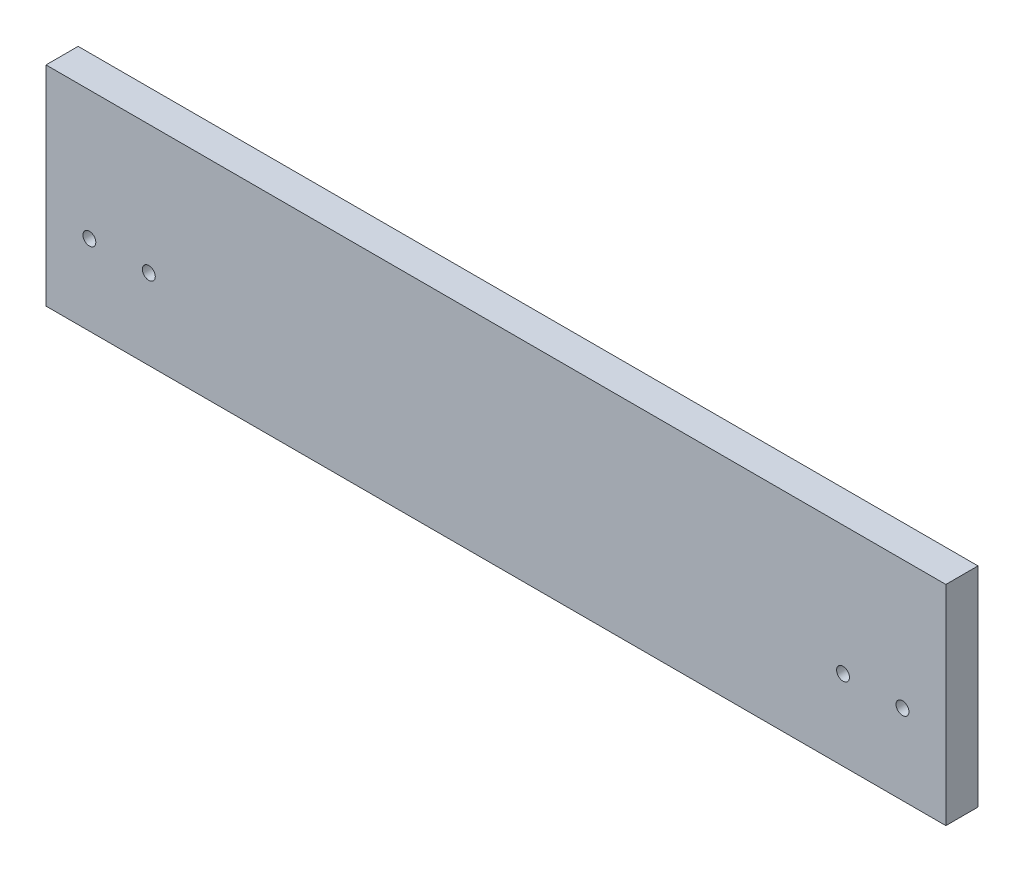
ISO-10303-21;
HEADER;
FILE_DESCRIPTION(('STEP AP214'),'2;1');
FILE_NAME('part.step','',(''),(''),'','','');
FILE_SCHEMA(('AUTOMOTIVE_DESIGN { 1 0 10303 214 1 1 1 1 }'));
ENDSEC;
DATA;
#1=APPLICATION_CONTEXT('core data for automotive mechanical design processes');
#2=APPLICATION_PROTOCOL_DEFINITION('international standard','automotive_design',2000,#1);
#3=PRODUCT_CONTEXT('',#1,'mechanical');
#4=PRODUCT('Part','Part','',(#3));
#5=PRODUCT_RELATED_PRODUCT_CATEGORY('part','',(#4));
#6=PRODUCT_DEFINITION_FORMATION('','',#4);
#7=PRODUCT_DEFINITION_CONTEXT('part definition',#1,'design');
#8=PRODUCT_DEFINITION('design','',#6,#7);
#9=PRODUCT_DEFINITION_SHAPE('','',#8);
#10=(LENGTH_UNIT() NAMED_UNIT(*) SI_UNIT(.MILLI.,.METRE.));
#11=(NAMED_UNIT(*) PLANE_ANGLE_UNIT() SI_UNIT($,.RADIAN.));
#12=(NAMED_UNIT(*) SI_UNIT($,.STERADIAN.) SOLID_ANGLE_UNIT());
#13=UNCERTAINTY_MEASURE_WITH_UNIT(LENGTH_MEASURE(1.E-05),#10,'distance_accuracy_value','');
#14=(GEOMETRIC_REPRESENTATION_CONTEXT(3) GLOBAL_UNCERTAINTY_ASSIGNED_CONTEXT((#13)) GLOBAL_UNIT_ASSIGNED_CONTEXT((#10,
#11,#12)) REPRESENTATION_CONTEXT('',''));
#15=CARTESIAN_POINT('',(0.,0.,0.));
#16=DIRECTION('',(0.,0.,1.));
#17=DIRECTION('',(1.,0.,0.));
#18=AXIS2_PLACEMENT_3D('',#15,#16,#17);
#19=CARTESIAN_POINT('',(0.,0.,10.));
#20=DIRECTION('',(-1.,0.,0.));
#21=DIRECTION('',(0.,-1.,0.));
#22=AXIS2_PLACEMENT_3D('',#19,#20,#21);
#23=PLANE('',#22);
#24=DIRECTION('',(0.,1.,0.));
#25=VECTOR('',#24,1.);
#26=CARTESIAN_POINT('',(0.,0.,0.));
#27=LINE('',#26,#25);
#28=CARTESIAN_POINT('',(0.,0.,0.));
#29=VERTEX_POINT('',#28);
#30=CARTESIAN_POINT('',(0.,65.,0.));
#31=VERTEX_POINT('',#30);
#32=EDGE_CURVE('E100',#29,#31,#27,.T.);
#33=ORIENTED_EDGE('',*,*,#32,.T.);
#34=DIRECTION('',(0.,0.,-1.));
#35=VECTOR('',#34,1.);
#36=CARTESIAN_POINT('',(0.,65.,10.));
#37=LINE('',#36,#35);
#38=CARTESIAN_POINT('',(0.,65.,10.));
#39=VERTEX_POINT('',#38);
#40=EDGE_CURVE('E11',#39,#31,#37,.T.);
#41=ORIENTED_EDGE('',*,*,#40,.F.);
#42=DIRECTION('',(0.,1.,0.));
#43=VECTOR('',#42,1.);
#44=CARTESIAN_POINT('',(0.,0.,10.));
#45=LINE('',#44,#43);
#46=CARTESIAN_POINT('',(0.,0.,10.));
#47=VERTEX_POINT('',#46);
#48=EDGE_CURVE('E88',#47,#39,#45,.T.);
#49=ORIENTED_EDGE('',*,*,#48,.F.);
#50=DIRECTION('',(0.,0.,-1.));
#51=VECTOR('',#50,1.);
#52=CARTESIAN_POINT('',(0.,0.,10.));
#53=LINE('',#52,#51);
#54=EDGE_CURVE('E96',#47,#29,#53,.T.);
#55=ORIENTED_EDGE('',*,*,#54,.T.);
#56=EDGE_LOOP('',(#33,#41,#49,#55));
#57=FACE_BOUND('',#56,.T.);
#58=ADVANCED_FACE('F37',(#57),#23,.F.);
#59=CARTESIAN_POINT('',(0.,65.,10.));
#60=DIRECTION('',(0.,-1.,0.));
#61=DIRECTION('',(1.,0.,0.));
#62=AXIS2_PLACEMENT_3D('',#59,#60,#61);
#63=PLANE('',#62);
#64=DIRECTION('',(-1.,0.,0.));
#65=VECTOR('',#64,1.);
#66=CARTESIAN_POINT('',(0.,65.,0.));
#67=LINE('',#66,#65);
#68=CARTESIAN_POINT('',(-280.,65.,0.));
#69=VERTEX_POINT('',#68);
#70=EDGE_CURVE('E92',#31,#69,#67,.T.);
#71=ORIENTED_EDGE('',*,*,#70,.T.);
#72=DIRECTION('',(0.,0.,-1.));
#73=VECTOR('',#72,1.);
#74=CARTESIAN_POINT('',(-280.,65.,10.));
#75=LINE('',#74,#73);
#76=CARTESIAN_POINT('',(-280.,65.,10.));
#77=VERTEX_POINT('',#76);
#78=EDGE_CURVE('E45',#77,#69,#75,.T.);
#79=ORIENTED_EDGE('',*,*,#78,.F.);
#80=DIRECTION('',(-1.,0.,0.));
#81=VECTOR('',#80,1.);
#82=CARTESIAN_POINT('',(0.,65.,10.));
#83=LINE('',#82,#81);
#84=EDGE_CURVE('E83',#39,#77,#83,.T.);
#85=ORIENTED_EDGE('',*,*,#84,.F.);
#86=ORIENTED_EDGE('',*,*,#40,.T.);
#87=EDGE_LOOP('',(#71,#79,#85,#86));
#88=FACE_BOUND('',#87,.T.);
#89=ADVANCED_FACE('F91',(#88),#63,.F.);
#90=CARTESIAN_POINT('',(-280.,0.,10.));
#91=DIRECTION('',(1.,0.,0.));
#92=DIRECTION('',(0.,0.,-1.));
#93=AXIS2_PLACEMENT_3D('',#90,#91,#92);
#94=PLANE('',#93);
#95=DIRECTION('',(0.,-1.,0.));
#96=VECTOR('',#95,1.);
#97=CARTESIAN_POINT('',(-280.,0.,0.));
#98=LINE('',#97,#96);
#99=CARTESIAN_POINT('',(-280.,0.,0.));
#100=VERTEX_POINT('',#99);
#101=EDGE_CURVE('E70',#69,#100,#98,.T.);
#102=ORIENTED_EDGE('',*,*,#101,.T.);
#103=DIRECTION('',(0.,0.,-1.));
#104=VECTOR('',#103,1.);
#105=CARTESIAN_POINT('',(-280.,0.,10.));
#106=LINE('',#105,#104);
#107=CARTESIAN_POINT('',(-280.,0.,10.));
#108=VERTEX_POINT('',#107);
#109=EDGE_CURVE('E93',#108,#100,#106,.T.);
#110=ORIENTED_EDGE('',*,*,#109,.F.);
#111=DIRECTION('',(0.,-1.,0.));
#112=VECTOR('',#111,1.);
#113=CARTESIAN_POINT('',(-280.,0.,10.));
#114=LINE('',#113,#112);
#115=EDGE_CURVE('E86',#77,#108,#114,.T.);
#116=ORIENTED_EDGE('',*,*,#115,.F.);
#117=ORIENTED_EDGE('',*,*,#78,.T.);
#118=EDGE_LOOP('',(#102,#110,#116,#117));
#119=FACE_BOUND('',#118,.T.);
#120=ADVANCED_FACE('F94',(#119),#94,.F.);
#121=CARTESIAN_POINT('',(0.,0.,10.));
#122=DIRECTION('',(0.,1.,0.));
#123=DIRECTION('',(-1.,0.,0.));
#124=AXIS2_PLACEMENT_3D('',#121,#122,#123);
#125=PLANE('',#124);
#126=DIRECTION('',(1.,0.,0.));
#127=VECTOR('',#126,1.);
#128=CARTESIAN_POINT('',(0.,0.,0.));
#129=LINE('',#128,#127);
#130=EDGE_CURVE('E76',#100,#29,#129,.T.);
#131=ORIENTED_EDGE('',*,*,#130,.T.);
#132=ORIENTED_EDGE('',*,*,#54,.F.);
#133=DIRECTION('',(1.,0.,0.));
#134=VECTOR('',#133,1.);
#135=CARTESIAN_POINT('',(0.,0.,10.));
#136=LINE('',#135,#134);
#137=EDGE_CURVE('E53',#108,#47,#136,.T.);
#138=ORIENTED_EDGE('',*,*,#137,.F.);
#139=ORIENTED_EDGE('',*,*,#109,.T.);
#140=EDGE_LOOP('',(#131,#132,#138,#139));
#141=FACE_BOUND('',#140,.T.);
#142=ADVANCED_FACE('F108',(#141),#125,.F.);
#143=CARTESIAN_POINT('',(0.,0.,10.));
#144=DIRECTION('',(0.,0.,1.));
#145=DIRECTION('',(1.,0.,0.));
#146=AXIS2_PLACEMENT_3D('',#143,#144,#145);
#147=PLANE('',#146);
#148=CARTESIAN_POINT('',(-266.5,24.9336942218761,10.));
#149=DIRECTION('',(0.,0.,-1.));
#150=DIRECTION('',(-1.,0.,0.));
#151=AXIS2_PLACEMENT_3D('',#148,#149,#150);
#152=CIRCLE('',#151,2.);
#153=CARTESIAN_POINT('',(-268.5,24.9336942218761,10.));
#154=VERTEX_POINT('',#153);
#155=EDGE_CURVE('E127',#154,#154,#152,.T.);
#156=ORIENTED_EDGE('',*,*,#155,.T.);
#157=EDGE_LOOP('',(#156));
#158=FACE_BOUND('',#157,.T.);
#159=CARTESIAN_POINT('',(-13.5,24.9336942218761,10.));
#160=DIRECTION('',(0.,0.,-1.));
#161=DIRECTION('',(-1.,0.,0.));
#162=AXIS2_PLACEMENT_3D('',#159,#160,#161);
#163=CIRCLE('',#162,2.);
#164=CARTESIAN_POINT('',(-15.5,24.9336942218761,10.));
#165=VERTEX_POINT('',#164);
#166=EDGE_CURVE('E120',#165,#165,#163,.T.);
#167=ORIENTED_EDGE('',*,*,#166,.T.);
#168=EDGE_LOOP('',(#167));
#169=FACE_BOUND('',#168,.T.);
#170=CARTESIAN_POINT('',(-32.,24.9336942218761,10.));
#171=DIRECTION('',(0.,0.,-1.));
#172=DIRECTION('',(-1.,0.,0.));
#173=AXIS2_PLACEMENT_3D('',#170,#171,#172);
#174=CIRCLE('',#173,2.);
#175=CARTESIAN_POINT('',(-34.,24.9336942218761,10.));
#176=VERTEX_POINT('',#175);
#177=EDGE_CURVE('E132',#176,#176,#174,.T.);
#178=ORIENTED_EDGE('',*,*,#177,.T.);
#179=EDGE_LOOP('',(#178));
#180=FACE_BOUND('',#179,.T.);
#181=CARTESIAN_POINT('',(-248.,24.9336942218761,10.));
#182=DIRECTION('',(0.,0.,-1.));
#183=DIRECTION('',(-1.,0.,0.));
#184=AXIS2_PLACEMENT_3D('',#181,#182,#183);
#185=CIRCLE('',#184,1.99999999999997);
#186=CARTESIAN_POINT('',(-250.,24.9336942218761,10.));
#187=VERTEX_POINT('',#186);
#188=EDGE_CURVE('E103',#187,#187,#185,.T.);
#189=ORIENTED_EDGE('',*,*,#188,.T.);
#190=EDGE_LOOP('',(#189));
#191=FACE_BOUND('',#190,.T.);
#192=ORIENTED_EDGE('',*,*,#48,.T.);
#193=ORIENTED_EDGE('',*,*,#84,.T.);
#194=ORIENTED_EDGE('',*,*,#115,.T.);
#195=ORIENTED_EDGE('',*,*,#137,.T.);
#196=EDGE_LOOP('',(#192,#193,#194,#195));
#197=FACE_BOUND('',#196,.T.);
#198=ADVANCED_FACE('F84',(#158,#169,#180,#191,#197),#147,.T.);
#199=CARTESIAN_POINT('',(0.,0.,0.));
#200=DIRECTION('',(0.,0.,1.));
#201=DIRECTION('',(1.,0.,0.));
#202=AXIS2_PLACEMENT_3D('',#199,#200,#201);
#203=PLANE('',#202);
#204=CARTESIAN_POINT('',(-266.5,24.9336942218761,0.));
#205=DIRECTION('',(0.,0.,-1.));
#206=DIRECTION('',(-1.,0.,0.));
#207=AXIS2_PLACEMENT_3D('',#204,#205,#206);
#208=CIRCLE('',#207,2.);
#209=CARTESIAN_POINT('',(-268.5,24.9336942218761,0.));
#210=VERTEX_POINT('',#209);
#211=EDGE_CURVE('E117',#210,#210,#208,.T.);
#212=ORIENTED_EDGE('',*,*,#211,.F.);
#213=EDGE_LOOP('',(#212));
#214=FACE_BOUND('',#213,.T.);
#215=CARTESIAN_POINT('',(-13.5,24.9336942218761,0.));
#216=DIRECTION('',(0.,0.,-1.));
#217=DIRECTION('',(-1.,0.,0.));
#218=AXIS2_PLACEMENT_3D('',#215,#216,#217);
#219=CIRCLE('',#218,2.);
#220=CARTESIAN_POINT('',(-15.5,24.9336942218761,0.));
#221=VERTEX_POINT('',#220);
#222=EDGE_CURVE('E123',#221,#221,#219,.T.);
#223=ORIENTED_EDGE('',*,*,#222,.F.);
#224=EDGE_LOOP('',(#223));
#225=FACE_BOUND('',#224,.T.);
#226=CARTESIAN_POINT('',(-32.,24.9336942218761,0.));
#227=DIRECTION('',(0.,0.,-1.));
#228=DIRECTION('',(-1.,0.,0.));
#229=AXIS2_PLACEMENT_3D('',#226,#227,#228);
#230=CIRCLE('',#229,2.);
#231=CARTESIAN_POINT('',(-34.,24.9336942218761,0.));
#232=VERTEX_POINT('',#231);
#233=EDGE_CURVE('E124',#232,#232,#230,.T.);
#234=ORIENTED_EDGE('',*,*,#233,.F.);
#235=EDGE_LOOP('',(#234));
#236=FACE_BOUND('',#235,.T.);
#237=CARTESIAN_POINT('',(-248.,24.9336942218761,0.));
#238=DIRECTION('',(0.,0.,-1.));
#239=DIRECTION('',(-1.,0.,0.));
#240=AXIS2_PLACEMENT_3D('',#237,#238,#239);
#241=CIRCLE('',#240,1.99999999999997);
#242=CARTESIAN_POINT('',(-250.,24.9336942218761,0.));
#243=VERTEX_POINT('',#242);
#244=EDGE_CURVE('E114',#243,#243,#241,.T.);
#245=ORIENTED_EDGE('',*,*,#244,.F.);
#246=EDGE_LOOP('',(#245));
#247=FACE_BOUND('',#246,.T.);
#248=ORIENTED_EDGE('',*,*,#32,.F.);
#249=ORIENTED_EDGE('',*,*,#130,.F.);
#250=ORIENTED_EDGE('',*,*,#101,.F.);
#251=ORIENTED_EDGE('',*,*,#70,.F.);
#252=EDGE_LOOP('',(#248,#249,#250,#251));
#253=FACE_BOUND('',#252,.T.);
#254=ADVANCED_FACE('F111',(#214,#225,#236,#247,#253),#203,.F.);
#255=CARTESIAN_POINT('',(-248.,24.9336942218761,10.));
#256=DIRECTION('',(0.,0.,-1.));
#257=DIRECTION('',(-1.,0.,0.));
#258=AXIS2_PLACEMENT_3D('',#255,#256,#257);
#259=CYLINDRICAL_SURFACE('',#258,1.99999999999997);
#260=ORIENTED_EDGE('',*,*,#188,.F.);
#261=EDGE_LOOP('',(#260));
#262=FACE_BOUND('',#261,.T.);
#263=ORIENTED_EDGE('',*,*,#244,.T.);
#264=EDGE_LOOP('',(#263));
#265=FACE_BOUND('',#264,.T.);
#266=ADVANCED_FACE('F142',(#262,#265),#259,.F.);
#267=CARTESIAN_POINT('',(-32.,24.9336942218761,10.));
#268=DIRECTION('',(0.,0.,-1.));
#269=DIRECTION('',(-1.,0.,0.));
#270=AXIS2_PLACEMENT_3D('',#267,#268,#269);
#271=CYLINDRICAL_SURFACE('',#270,2.);
#272=ORIENTED_EDGE('',*,*,#177,.F.);
#273=EDGE_LOOP('',(#272));
#274=FACE_BOUND('',#273,.T.);
#275=ORIENTED_EDGE('',*,*,#233,.T.);
#276=EDGE_LOOP('',(#275));
#277=FACE_BOUND('',#276,.T.);
#278=ADVANCED_FACE('F138',(#274,#277),#271,.F.);
#279=CARTESIAN_POINT('',(-13.5,24.9336942218761,10.));
#280=DIRECTION('',(0.,0.,-1.));
#281=DIRECTION('',(-1.,0.,0.));
#282=AXIS2_PLACEMENT_3D('',#279,#280,#281);
#283=CYLINDRICAL_SURFACE('',#282,2.);
#284=ORIENTED_EDGE('',*,*,#166,.F.);
#285=EDGE_LOOP('',(#284));
#286=FACE_BOUND('',#285,.T.);
#287=ORIENTED_EDGE('',*,*,#222,.T.);
#288=EDGE_LOOP('',(#287));
#289=FACE_BOUND('',#288,.T.);
#290=ADVANCED_FACE('F153',(#286,#289),#283,.F.);
#291=CARTESIAN_POINT('',(-266.5,24.9336942218761,10.));
#292=DIRECTION('',(0.,0.,-1.));
#293=DIRECTION('',(-1.,0.,0.));
#294=AXIS2_PLACEMENT_3D('',#291,#292,#293);
#295=CYLINDRICAL_SURFACE('',#294,2.);
#296=ORIENTED_EDGE('',*,*,#155,.F.);
#297=EDGE_LOOP('',(#296));
#298=FACE_BOUND('',#297,.T.);
#299=ORIENTED_EDGE('',*,*,#211,.T.);
#300=EDGE_LOOP('',(#299));
#301=FACE_BOUND('',#300,.T.);
#302=ADVANCED_FACE('F182',(#298,#301),#295,.F.);
#303=CLOSED_SHELL('',(#58,#89,#120,#142,#198,#254,#266,#278,#290,#302));
#304=MANIFOLD_SOLID_BREP('B2',#303);
#305=ADVANCED_BREP_SHAPE_REPRESENTATION('',(#18,#304),#14);
#306=SHAPE_DEFINITION_REPRESENTATION(#9,#305);
ENDSEC;
END-ISO-10303-21;
